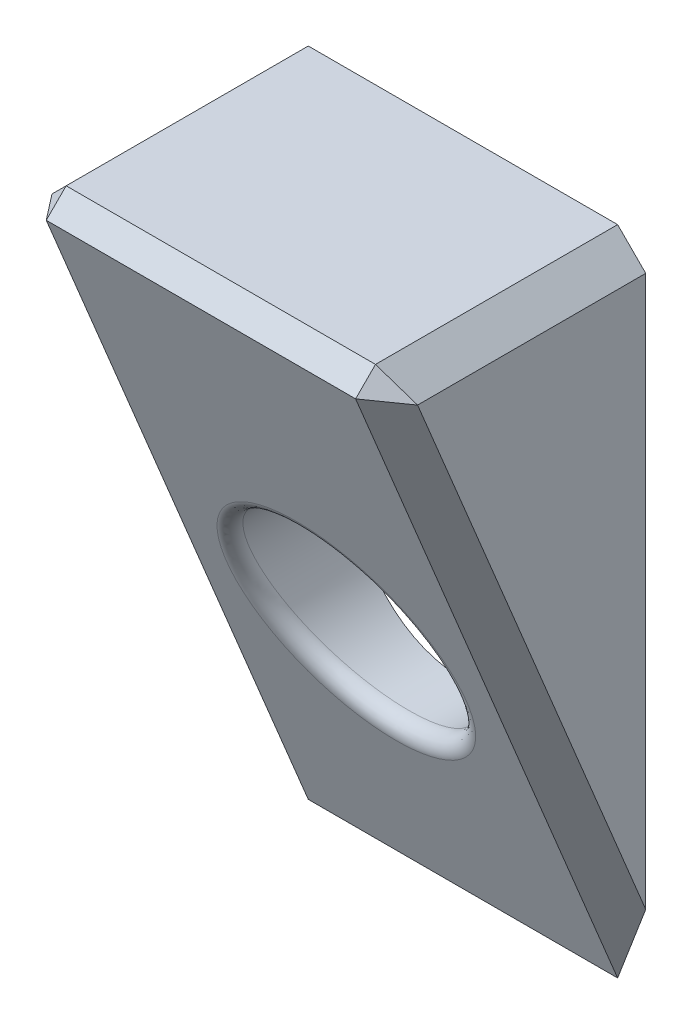
ISO-10303-21;
HEADER;
FILE_DESCRIPTION(('STEP AP214'),'2;1');
FILE_NAME('part.step','',(''),(''),'','','');
FILE_SCHEMA(('AUTOMOTIVE_DESIGN { 1 0 10303 214 1 1 1 1 }'));
ENDSEC;
DATA;
#1=APPLICATION_CONTEXT('core data for automotive mechanical design processes');
#2=APPLICATION_PROTOCOL_DEFINITION('international standard','automotive_design',2000,#1);
#3=PRODUCT_CONTEXT('',#1,'mechanical');
#4=PRODUCT('Part','Part','',(#3));
#5=PRODUCT_RELATED_PRODUCT_CATEGORY('part','',(#4));
#6=PRODUCT_DEFINITION_FORMATION('','',#4);
#7=PRODUCT_DEFINITION_CONTEXT('part definition',#1,'design');
#8=PRODUCT_DEFINITION('design','',#6,#7);
#9=PRODUCT_DEFINITION_SHAPE('','',#8);
#10=(LENGTH_UNIT() NAMED_UNIT(*) SI_UNIT(.MILLI.,.METRE.));
#11=(NAMED_UNIT(*) PLANE_ANGLE_UNIT() SI_UNIT($,.RADIAN.));
#12=(NAMED_UNIT(*) SI_UNIT($,.STERADIAN.) SOLID_ANGLE_UNIT());
#13=UNCERTAINTY_MEASURE_WITH_UNIT(LENGTH_MEASURE(1.E-05),#10,'distance_accuracy_value','');
#14=(GEOMETRIC_REPRESENTATION_CONTEXT(3) GLOBAL_UNCERTAINTY_ASSIGNED_CONTEXT((#13)) GLOBAL_UNIT_ASSIGNED_CONTEXT((#10,
#11,#12)) REPRESENTATION_CONTEXT('',''));
#15=CARTESIAN_POINT('',(0.,0.,0.));
#16=DIRECTION('',(0.,0.,1.));
#17=DIRECTION('',(1.,0.,0.));
#18=AXIS2_PLACEMENT_3D('',#15,#16,#17);
#19=CARTESIAN_POINT('',(13.,5.16738551201379,9.60975464705583));
#20=DIRECTION('',(0.,0.382683432365091,-0.923879532511286));
#21=DIRECTION('',(0.,0.923879532511287,0.382683432365091));
#22=AXIS2_PLACEMENT_3D('',#19,#20,#21);
#23=PLANE('',#22);
#24=CARTESIAN_POINT('',(6.5,-8.02395620416875,4.14572200231502));
#25=DIRECTION('',(0.,0.382683432365091,-0.923879532511286));
#26=DIRECTION('',(0.,-0.923879532511287,-0.382683432365091));
#27=AXIS2_PLACEMENT_3D('',#24,#25,#26);
#28=ELLIPSE('',#27,4.60016685124268,4.25);
#29=CARTESIAN_POINT('',(6.5,-12.2739562041687,2.38531436222937));
#30=VERTEX_POINT('',#29);
#31=EDGE_CURVE('E58',#30,#30,#28,.T.);
#32=ORIENTED_EDGE('',*,*,#31,.T.);
#33=EDGE_LOOP('',(#32));
#34=FACE_BOUND('',#33,.T.);
#35=DIRECTION('',(-1.,0.,0.));
#36=VECTOR('',#35,1.);
#37=CARTESIAN_POINT('',(13.,4.46027873082724,9.31686142824237));
#38=LINE('',#37,#36);
#39=CARTESIAN_POINT('',(12.,4.46027873082724,9.31686142824237));
#40=VERTEX_POINT('',#39);
#41=CARTESIAN_POINT('',(0.999999999999999,4.46027873082724,9.31686142824237));
#42=VERTEX_POINT('',#41);
#43=EDGE_CURVE('E73',#40,#42,#38,.T.);
#44=ORIENTED_EDGE('',*,*,#43,.T.);
#45=DIRECTION('',(0.,-0.923879532511287,-0.382683432365091));
#46=VECTOR('',#45,1.);
#47=CARTESIAN_POINT('',(0.999999999999999,-18.0326144879862,0.));
#48=LINE('',#47,#46);
#49=CARTESIAN_POINT('',(1.,-18.0326144879862,0.));
#50=VERTEX_POINT('',#49);
#51=EDGE_CURVE('E146',#42,#50,#48,.T.);
#52=ORIENTED_EDGE('',*,*,#51,.T.);
#53=DIRECTION('',(-1.,0.,0.));
#54=VECTOR('',#53,1.);
#55=CARTESIAN_POINT('',(13.,-18.0326144879862,0.));
#56=LINE('',#55,#54);
#57=CARTESIAN_POINT('',(12.,-18.0326144879862,0.));
#58=VERTEX_POINT('',#57);
#59=EDGE_CURVE('E122',#58,#50,#56,.T.);
#60=ORIENTED_EDGE('',*,*,#59,.F.);
#61=DIRECTION('',(0.,0.923879532511287,0.382683432365091));
#62=VECTOR('',#61,1.);
#63=CARTESIAN_POINT('',(12.,5.16738551201379,9.60975464705583));
#64=LINE('',#63,#62);
#65=EDGE_CURVE('E143',#58,#40,#64,.T.);
#66=ORIENTED_EDGE('',*,*,#65,.T.);
#67=EDGE_LOOP('',(#44,#52,#60,#66));
#68=FACE_BOUND('',#67,.T.);
#69=ADVANCED_FACE('F47',(#34,#68),#23,.F.);
#70=CARTESIAN_POINT('',(13.,5.16738551201379,0.));
#71=DIRECTION('',(0.,0.,1.));
#72=DIRECTION('',(1.,0.,0.));
#73=AXIS2_PLACEMENT_3D('',#70,#71,#72);
#74=PLANE('',#73);
#75=CARTESIAN_POINT('',(6.5,-7.8326144879862,0.));
#76=DIRECTION('',(0.,0.,-1.));
#77=DIRECTION('',(-1.,0.,0.));
#78=AXIS2_PLACEMENT_3D('',#75,#76,#77);
#79=CIRCLE('',#78,3.75);
#80=CARTESIAN_POINT('',(2.75,-7.8326144879862,0.));
#81=VERTEX_POINT('',#80);
#82=EDGE_CURVE('E167',#81,#81,#79,.T.);
#83=ORIENTED_EDGE('',*,*,#82,.F.);
#84=EDGE_LOOP('',(#83));
#85=FACE_BOUND('',#84,.T.);
#86=DIRECTION('',(0.,1.,0.));
#87=VECTOR('',#86,1.);
#88=CARTESIAN_POINT('',(0.,5.16738551201379,0.));
#89=LINE('',#88,#87);
#90=CARTESIAN_POINT('',(0.,-15.4194885582334,0.));
#91=VERTEX_POINT('',#90);
#92=CARTESIAN_POINT('',(0.,4.16738551201379,0.));
#93=VERTEX_POINT('',#92);
#94=EDGE_CURVE('E379',#91,#93,#89,.T.);
#95=ORIENTED_EDGE('',*,*,#94,.T.);
#96=DIRECTION('',(0.707106781186546,0.707106781186549,0.));
#97=VECTOR('',#96,1.);
#98=CARTESIAN_POINT('',(0.999999999999997,5.16738551201379,0.));
#99=LINE('',#98,#97);
#100=CARTESIAN_POINT('',(1.,5.16738551201379,0.));
#101=VERTEX_POINT('',#100);
#102=EDGE_CURVE('E130',#93,#101,#99,.T.);
#103=ORIENTED_EDGE('',*,*,#102,.T.);
#104=DIRECTION('',(-1.,0.,0.));
#105=VECTOR('',#104,1.);
#106=CARTESIAN_POINT('',(13.,5.16738551201379,0.));
#107=LINE('',#106,#105);
#108=CARTESIAN_POINT('',(12.,5.16738551201379,0.));
#109=VERTEX_POINT('',#108);
#110=EDGE_CURVE('E114',#109,#101,#107,.T.);
#111=ORIENTED_EDGE('',*,*,#110,.F.);
#112=DIRECTION('',(-0.707106781186547,0.707106781186547,0.));
#113=VECTOR('',#112,1.);
#114=CARTESIAN_POINT('',(13.,4.16738551201379,0.));
#115=LINE('',#114,#113);
#116=CARTESIAN_POINT('',(13.,4.16738551201379,0.));
#117=VERTEX_POINT('',#116);
#118=EDGE_CURVE('E128',#109,#117,#115,.F.);
#119=ORIENTED_EDGE('',*,*,#118,.T.);
#120=DIRECTION('',(0.,1.,0.));
#121=VECTOR('',#120,1.);
#122=CARTESIAN_POINT('',(13.,5.16738551201379,0.));
#123=LINE('',#122,#121);
#124=CARTESIAN_POINT('',(13.,-15.4194885582334,0.));
#125=VERTEX_POINT('',#124);
#126=EDGE_CURVE('E131',#125,#117,#123,.T.);
#127=ORIENTED_EDGE('',*,*,#126,.F.);
#128=DIRECTION('',(0.357406744336594,0.933948831094464,0.));
#129=VECTOR('',#128,1.);
#130=CARTESIAN_POINT('',(17.3932557613713,-3.9393580121584,0.));
#131=LINE('',#130,#129);
#132=EDGE_CURVE('E135',#125,#58,#131,.F.);
#133=ORIENTED_EDGE('',*,*,#132,.T.);
#134=ORIENTED_EDGE('',*,*,#59,.T.);
#135=DIRECTION('',(-0.357406744336593,0.933948831094465,0.));
#136=VECTOR('',#135,1.);
#137=CARTESIAN_POINT('',(-6.74415097748379,2.20382723519683,0.));
#138=LINE('',#137,#136);
#139=EDGE_CURVE('E134',#50,#91,#138,.T.);
#140=ORIENTED_EDGE('',*,*,#139,.T.);
#141=EDGE_LOOP('',(#95,#103,#111,#119,#127,#133,#134,#140));
#142=FACE_BOUND('',#141,.T.);
#143=ADVANCED_FACE('F126',(#85,#142),#74,.F.);
#144=CARTESIAN_POINT('',(13.,5.16738551201379,0.));
#145=DIRECTION('',(0.,-1.,0.));
#146=DIRECTION('',(0.,0.,-1.));
#147=AXIS2_PLACEMENT_3D('',#144,#145,#146);
#148=PLANE('',#147);
#149=ORIENTED_EDGE('',*,*,#110,.T.);
#150=DIRECTION('',(0.,0.,1.));
#151=VECTOR('',#150,1.);
#152=CARTESIAN_POINT('',(0.999999999999997,5.16738551201379,9.60975464705583));
#153=LINE('',#152,#151);
#154=CARTESIAN_POINT('',(0.999999999999997,5.16738551201379,8.60975464705583));
#155=VERTEX_POINT('',#154);
#156=EDGE_CURVE('E387',#101,#155,#153,.T.);
#157=ORIENTED_EDGE('',*,*,#156,.T.);
#158=DIRECTION('',(1.,0.,0.));
#159=VECTOR('',#158,1.);
#160=CARTESIAN_POINT('',(13.,5.16738551201379,8.60975464705583));
#161=LINE('',#160,#159);
#162=CARTESIAN_POINT('',(12.,5.16738551201379,8.60975464705583));
#163=VERTEX_POINT('',#162);
#164=EDGE_CURVE('E117',#155,#163,#161,.T.);
#165=ORIENTED_EDGE('',*,*,#164,.T.);
#166=DIRECTION('',(0.,0.,-1.));
#167=VECTOR('',#166,1.);
#168=CARTESIAN_POINT('',(12.,5.16738551201379,0.));
#169=LINE('',#168,#167);
#170=EDGE_CURVE('E110',#163,#109,#169,.T.);
#171=ORIENTED_EDGE('',*,*,#170,.T.);
#172=EDGE_LOOP('',(#149,#157,#165,#171));
#173=FACE_BOUND('',#172,.T.);
#174=ADVANCED_FACE('F112',(#173),#148,.F.);
#175=CARTESIAN_POINT('',(13.,0.,0.));
#176=DIRECTION('',(-1.,0.,0.));
#177=DIRECTION('',(0.,0.,1.));
#178=AXIS2_PLACEMENT_3D('',#175,#176,#177);
#179=PLANE('',#178);
#180=ORIENTED_EDGE('',*,*,#126,.T.);
#181=DIRECTION('',(0.,0.,1.));
#182=VECTOR('',#181,1.);
#183=CARTESIAN_POINT('',(13.,4.16738551201379,0.));
#184=LINE('',#183,#182);
#185=CARTESIAN_POINT('',(13.,4.16738551201379,8.11314888439033));
#186=VERTEX_POINT('',#185);
#187=EDGE_CURVE('E65',#117,#186,#184,.T.);
#188=ORIENTED_EDGE('',*,*,#187,.T.);
#189=DIRECTION('',(0.,-0.923879532511287,-0.382683432365091));
#190=VECTOR('',#189,1.);
#191=CARTESIAN_POINT('',(13.,-2.25813181813911,5.45161246097764));
#192=LINE('',#191,#190);
#193=EDGE_CURVE('E148',#186,#125,#192,.T.);
#194=ORIENTED_EDGE('',*,*,#193,.T.);
#195=EDGE_LOOP('',(#180,#188,#194));
#196=FACE_BOUND('',#195,.T.);
#197=ADVANCED_FACE('F238',(#196),#179,.F.);
#198=CARTESIAN_POINT('',(0.,0.,0.));
#199=DIRECTION('',(-1.,0.,0.));
#200=DIRECTION('',(0.,0.,1.));
#201=AXIS2_PLACEMENT_3D('',#198,#199,#200);
#202=PLANE('',#201);
#203=DIRECTION('',(0.,0.923879532511287,0.382683432365091));
#204=VECTOR('',#203,1.);
#205=CARTESIAN_POINT('',(0.,5.55006894437888,8.68587511454454));
#206=LINE('',#205,#204);
#207=CARTESIAN_POINT('',(0.,4.16738551201379,8.11314888439033));
#208=VERTEX_POINT('',#207);
#209=EDGE_CURVE('E389',#91,#208,#206,.T.);
#210=ORIENTED_EDGE('',*,*,#209,.T.);
#211=DIRECTION('',(0.,0.,-1.));
#212=VECTOR('',#211,1.);
#213=CARTESIAN_POINT('',(0.,4.16738551201379,0.));
#214=LINE('',#213,#212);
#215=EDGE_CURVE('E138',#208,#93,#214,.T.);
#216=ORIENTED_EDGE('',*,*,#215,.T.);
#217=ORIENTED_EDGE('',*,*,#94,.F.);
#218=EDGE_LOOP('',(#210,#216,#217));
#219=FACE_BOUND('',#218,.T.);
#220=ADVANCED_FACE('F233',(#219),#202,.T.);
#221=CARTESIAN_POINT('',(6.5,-7.8326144879862,15.));
#222=DIRECTION('',(0.,0.,-1.));
#223=DIRECTION('',(-1.,0.,0.));
#224=AXIS2_PLACEMENT_3D('',#221,#222,#223);
#225=CYLINDRICAL_SURFACE('',#224,3.75);
#226=CARTESIAN_POINT('',(6.5,-7.8326144879862,3.68378223605938));
#227=DIRECTION('',(0.,-0.424947402327079,0.905218042935219));
#228=DIRECTION('',(0.,-0.905218042935219,-0.424947402327079));
#229=AXIS2_PLACEMENT_3D('',#226,#227,#228);
#230=ELLIPSE('',#229,4.14264831469822,3.75);
#231=CARTESIAN_POINT('',(6.5,-11.5826144879862,1.92337459597372));
#232=VERTEX_POINT('',#231);
#233=EDGE_CURVE('E11',#232,#232,#230,.T.);
#234=ORIENTED_EDGE('',*,*,#233,.T.);
#235=EDGE_LOOP('',(#234));
#236=FACE_BOUND('',#235,.T.);
#237=ORIENTED_EDGE('',*,*,#82,.T.);
#238=EDGE_LOOP('',(#237));
#239=FACE_BOUND('',#238,.T.);
#240=ADVANCED_FACE('F229',(#236,#239),#225,.F.);
#241=CARTESIAN_POINT('',(13.,4.16738551201379,0.));
#242=DIRECTION('',(-0.707106781186547,-0.707106781186547,0.));
#243=DIRECTION('',(0.,0.,1.));
#244=AXIS2_PLACEMENT_3D('',#241,#242,#243);
#245=PLANE('',#244);
#246=ORIENTED_EDGE('',*,*,#118,.F.);
#247=ORIENTED_EDGE('',*,*,#170,.F.);
#248=DIRECTION('',(0.667168375633983,-0.667168375633983,-0.331319660008014));
#249=VECTOR('',#248,1.);
#250=CARTESIAN_POINT('',(12.,5.16738551201379,8.60975464705583));
#251=LINE('',#250,#249);
#252=EDGE_CURVE('E165',#186,#163,#251,.F.);
#253=ORIENTED_EDGE('',*,*,#252,.F.);
#254=ORIENTED_EDGE('',*,*,#187,.F.);
#255=EDGE_LOOP('',(#246,#247,#253,#254));
#256=FACE_BOUND('',#255,.T.);
#257=ADVANCED_FACE('F133',(#256),#245,.F.);
#258=CARTESIAN_POINT('',(13.,-2.25813181813911,5.45161246097764));
#259=DIRECTION('',(-0.707106781186547,0.270598050073099,-0.653281482438188));
#260=DIRECTION('',(0.,-0.923879532511287,-0.382683432365091));
#261=AXIS2_PLACEMENT_3D('',#258,#259,#260);
#262=PLANE('',#261);
#263=ORIENTED_EDGE('',*,*,#132,.F.);
#264=ORIENTED_EDGE('',*,*,#193,.F.);
#265=DIRECTION('',(-0.628110181084165,0.183969212707245,0.756064103892186));
#266=VECTOR('',#265,1.);
#267=CARTESIAN_POINT('',(12.2540907789744,4.38585726470262,9.01100917031379));
#268=LINE('',#267,#266);
#269=EDGE_CURVE('E162',#40,#186,#268,.F.);
#270=ORIENTED_EDGE('',*,*,#269,.F.);
#271=ORIENTED_EDGE('',*,*,#65,.F.);
#272=EDGE_LOOP('',(#263,#264,#270,#271));
#273=FACE_BOUND('',#272,.T.);
#274=ADVANCED_FACE('F219',(#273),#262,.F.);
#275=CARTESIAN_POINT('',(12.,5.16738551201379,8.60975464705583));
#276=DIRECTION('',(0.726830682541336,0.485652735458422,0.485652735458421));
#277=DIRECTION('',(-0.555570233019601,0.831469612302546,0.));
#278=AXIS2_PLACEMENT_3D('',#275,#276,#277);
#279=PLANE('',#278);
#280=ORIENTED_EDGE('',*,*,#269,.T.);
#281=ORIENTED_EDGE('',*,*,#252,.T.);
#282=DIRECTION('',(0.,0.707106781186547,-0.707106781186548));
#283=VECTOR('',#282,1.);
#284=CARTESIAN_POINT('',(12.,5.16738551201379,8.60975464705583));
#285=LINE('',#284,#283);
#286=EDGE_CURVE('E159',#40,#163,#285,.T.);
#287=ORIENTED_EDGE('',*,*,#286,.F.);
#288=EDGE_LOOP('',(#280,#281,#287));
#289=FACE_BOUND('',#288,.T.);
#290=ADVANCED_FACE('F213',(#289),#279,.T.);
#291=CARTESIAN_POINT('',(13.,4.46027873082724,9.31686142824237));
#292=DIRECTION('',(0.,-0.707106781186548,-0.707106781186547));
#293=DIRECTION('',(-1.,0.,0.));
#294=AXIS2_PLACEMENT_3D('',#291,#292,#293);
#295=PLANE('',#294);
#296=ORIENTED_EDGE('',*,*,#286,.T.);
#297=ORIENTED_EDGE('',*,*,#164,.F.);
#298=DIRECTION('',(0.,-0.707106781186547,0.707106781186548));
#299=VECTOR('',#298,1.);
#300=CARTESIAN_POINT('',(0.999999999999997,5.16738551201379,8.60975464705583));
#301=LINE('',#300,#299);
#302=EDGE_CURVE('E156',#42,#155,#301,.F.);
#303=ORIENTED_EDGE('',*,*,#302,.F.);
#304=ORIENTED_EDGE('',*,*,#43,.F.);
#305=EDGE_LOOP('',(#296,#297,#303,#304));
#306=FACE_BOUND('',#305,.T.);
#307=ADVANCED_FACE('F206',(#306),#295,.F.);
#308=CARTESIAN_POINT('',(0.999999999999997,5.16738551201379,9.60975464705583));
#309=DIRECTION('',(-0.707106781186549,-0.270598050073099,0.653281482438187));
#310=DIRECTION('',(0.,0.923879532511287,0.382683432365091));
#311=AXIS2_PLACEMENT_3D('',#308,#309,#310);
#312=PLANE('',#311);
#313=ORIENTED_EDGE('',*,*,#139,.F.);
#314=ORIENTED_EDGE('',*,*,#51,.F.);
#315=DIRECTION('',(0.628110181084164,0.183969212707243,0.756064103892187));
#316=VECTOR('',#315,1.);
#317=CARTESIAN_POINT('',(0.745909221025627,4.38585726470262,9.01100917031379));
#318=LINE('',#317,#316);
#319=EDGE_CURVE('E153',#208,#42,#318,.T.);
#320=ORIENTED_EDGE('',*,*,#319,.F.);
#321=ORIENTED_EDGE('',*,*,#209,.F.);
#322=EDGE_LOOP('',(#313,#314,#320,#321));
#323=FACE_BOUND('',#322,.T.);
#324=ADVANCED_FACE('F199',(#323),#312,.T.);
#325=CARTESIAN_POINT('',(0.999999999999997,5.16738551201379,8.60975464705583));
#326=DIRECTION('',(-0.726830682541336,0.485652735458421,0.485652735458422));
#327=DIRECTION('',(0.5555702330196,0.,0.831469612302547));
#328=AXIS2_PLACEMENT_3D('',#325,#326,#327);
#329=PLANE('',#328);
#330=ORIENTED_EDGE('',*,*,#319,.T.);
#331=ORIENTED_EDGE('',*,*,#302,.T.);
#332=DIRECTION('',(-0.667168375633982,-0.667168375633984,-0.331319660008013));
#333=VECTOR('',#332,1.);
#334=CARTESIAN_POINT('',(0.999999999999997,5.16738551201379,8.60975464705583));
#335=LINE('',#334,#333);
#336=EDGE_CURVE('E151',#208,#155,#335,.F.);
#337=ORIENTED_EDGE('',*,*,#336,.F.);
#338=EDGE_LOOP('',(#330,#331,#337));
#339=FACE_BOUND('',#338,.T.);
#340=ADVANCED_FACE('F178',(#339),#329,.T.);
#341=CARTESIAN_POINT('',(0.999999999999997,5.16738551201379,0.));
#342=DIRECTION('',(-0.707106781186549,0.707106781186546,0.));
#343=DIRECTION('',(0.,0.,-1.));
#344=AXIS2_PLACEMENT_3D('',#341,#342,#343);
#345=PLANE('',#344);
#346=ORIENTED_EDGE('',*,*,#102,.F.);
#347=ORIENTED_EDGE('',*,*,#215,.F.);
#348=ORIENTED_EDGE('',*,*,#336,.T.);
#349=ORIENTED_EDGE('',*,*,#156,.F.);
#350=EDGE_LOOP('',(#346,#347,#348,#349));
#351=FACE_BOUND('',#350,.T.);
#352=ADVANCED_FACE('F173',(#351),#345,.T.);
#353=CARTESIAN_POINT('',(6.5,-11.5826144879862,1.92337459597372));
#354=CARTESIAN_POINT('',(6.5,-11.5826144879862,2.67167747730647));
#355=CARTESIAN_POINT('',(6.5,-12.2739562041687,2.38531436222937));
#356=CARTESIAN_POINT('',(6.33629628844766,-11.5826144879862,1.92337459597372));
#357=CARTESIAN_POINT('',(6.34982423694392,-11.5826144879862,2.67167747730647));
#358=CARTESIAN_POINT('',(6.31446912690735,-12.2739562041687,2.38531436222937));
#359=CARTESIAN_POINT('',(6.17259257689533,-11.5718688481909,1.92841905101192));
#360=CARTESIAN_POINT('',(6.19991535972019,-11.5736941762921,2.67537239139076));
#361=CARTESIAN_POINT('',(6.1289382538147,-12.2617778124008,2.39035881726756));
#362=CARTESIAN_POINT('',(5.84799232155408,-11.529134888524,1.94848016810225));
#363=CARTESIAN_POINT('',(5.90103134274787,-11.5378882832473,2.69020367790279));
#364=CARTESIAN_POINT('',(5.76105796442796,-12.2133459914449,2.41041993435789));
#365=CARTESIAN_POINT('',(5.68710526446067,-11.4970852291886,1.96352562547725));
#366=CARTESIAN_POINT('',(5.75257293556618,-11.5110759027331,2.7013097295513));
#367=CARTESIAN_POINT('',(5.57871929972209,-12.1770230441981,2.4254653917329));
#368=CARTESIAN_POINT('',(5.37087726767107,-11.4123530901388,2.00330245346229));
#369=CARTESIAN_POINT('',(5.45825218531089,-11.4393117526863,2.73103541379283));
#370=CARTESIAN_POINT('',(5.22032757002721,-12.0809932866084,2.46524221971794));
#371=CARTESIAN_POINT('',(5.21557204251773,-11.3595571466939,2.02808708871725));
#372=CARTESIAN_POINT('',(5.31285745389423,-11.3944988564846,2.74959752316882));
#373=CARTESIAN_POINT('',(5.0443149815201,-12.0211578840374,2.49002685497289));
#374=CARTESIAN_POINT('',(4.91313482505802,-11.2342847792195,2.08689520412886));
#375=CARTESIAN_POINT('',(5.02662355338587,-11.2866369747938,2.79427537742823));
#376=CARTESIAN_POINT('',(4.70155280173242,-11.8791825342331,2.54883497038451));
#377=CARTESIAN_POINT('',(4.76607550115616,-11.1616590063907,2.12098879489018));
#378=CARTESIAN_POINT('',(4.88617631625704,-11.2237788087994,2.82031208228901));
#379=CARTESIAN_POINT('',(4.53488556797698,-11.7968733250272,2.58292856114582));
#380=CARTESIAN_POINT('',(4.48260703579815,-10.9979998670855,2.19781727467756));
#381=CARTESIAN_POINT('',(4.61210788077741,-11.0799646139666,2.8798818722505));
#382=CARTESIAN_POINT('',(4.2136213072379,-11.6113929671479,2.6597570409332));
#383=CARTESIAN_POINT('',(4.34631017855817,-10.906800931251,2.24062988892043));
#384=CARTESIAN_POINT('',(4.47878418756517,-10.9992336878075,2.91332171676857));
#385=CARTESIAN_POINT('',(4.05915153569926,-11.5080341732022,2.70256965517608));
#386=CARTESIAN_POINT('',(4.08665907806949,-10.7075652135072,2.33415951017219));
#387=CARTESIAN_POINT('',(4.22147240173298,-10.8201884860456,2.98748466761618));
#388=CARTESIAN_POINT('',(3.76488028847875,-11.2822336930926,2.79609927642783));
#389=CARTESIAN_POINT('',(3.96345133872488,-10.5993658797249,2.38495282586355));
#390=CARTESIAN_POINT('',(4.09767714922282,-10.7221145399291,3.02810822621305));
#391=CARTESIAN_POINT('',(3.62524485055487,-11.1596077814726,2.84689259211919));
#392=CARTESIAN_POINT('',(3.73205460948424,-10.367970770609,2.49357941732115));
#393=CARTESIAN_POINT('',(3.86204085160101,-10.5093669358623,3.11623116917992));
#394=CARTESIAN_POINT('',(3.36299522408214,-10.8973599911413,2.95551918357679));
#395=CARTESIAN_POINT('',(3.62403455042671,-10.2446311632946,2.55148021386555));
#396=CARTESIAN_POINT('',(3.75028551033849,-10.3949305568852,3.16363226938108));
#397=CARTESIAN_POINT('',(3.24057249048361,-10.7575751028516,3.01341998012119));
#398=CARTESIAN_POINT('',(3.42484298573715,-9.98504126653803,2.67334262387602));
#399=CARTESIAN_POINT('',(3.54130419811893,-10.1509441029614,3.26469476763164));
#400=CARTESIAN_POINT('',(3.01482205050211,-10.4633732198608,3.13528239013166));
#401=CARTESIAN_POINT('',(3.33384718792078,-9.84867617749844,2.73735812909902));
#402=CARTESIAN_POINT('',(3.44406044427285,-10.0216121357664,3.31826582249224));
#403=CARTESIAN_POINT('',(2.91169347964355,-10.3088261189493,3.19929789535467));
#404=CARTESIAN_POINT('',(3.17025929776495,-9.56533519781784,2.87037029586678));
#405=CARTESIAN_POINT('',(3.26648895751602,-9.74980289778662,3.43085289524174));
#406=CARTESIAN_POINT('',(2.72629387080027,-9.98770634197794,3.33231006212242));
#407=CARTESIAN_POINT('',(3.09783284022871,-9.41827787806089,2.93940518366162));
#408=CARTESIAN_POINT('',(3.18604783679383,-9.60751109363765,3.48979209033478));
#409=CARTESIAN_POINT('',(2.64421055225921,-9.82104137958672,3.40134494991726));
#410=CARTESIAN_POINT('',(2.9726381469138,-9.11603265254446,3.08129179810923));
#411=CARTESIAN_POINT('',(3.04415993974084,-9.31217475968189,3.6121244053208));
#412=CARTESIAN_POINT('',(2.50232323316897,-9.4784967906681,3.54323156436487));
#413=CARTESIAN_POINT('',(2.92000969312223,-8.96079544293948,3.15416667005968));
#414=CARTESIAN_POINT('',(2.98251469778597,-9.15927204632186,3.67545878291817));
#415=CARTESIAN_POINT('',(2.44267765220519,-9.30256128644912,3.61610643631532));
#416=CARTESIAN_POINT('',(2.83534218857542,-8.64481346474449,3.30250189367137));
#417=CARTESIAN_POINT('',(2.87990036953432,-8.84545039985057,3.80544796505284));
#418=CARTESIAN_POINT('',(2.34672114705214,-8.94444837782813,3.76444165992701));
#419=CARTESIAN_POINT('',(2.80340403361202,-8.48404567415238,3.37797305282818));
#420=CARTESIAN_POINT('',(2.83865992203734,-8.68462055730425,3.87206586706985));
#421=CARTESIAN_POINT('',(2.31052457142696,-8.76224488182374,3.83991281908383));
#422=CARTESIAN_POINT('',(2.76070653183443,-8.15972736585067,3.53022170022924));
#423=CARTESIAN_POINT('',(2.77808264966778,-8.35793563509705,4.00738319247087));
#424=CARTESIAN_POINT('',(2.26213406941235,-8.39468413241515,3.99216146648489));
#425=CARTESIAN_POINT('',(2.75,-7.99617092691844,3.60700196814431));
#426=CARTESIAN_POINT('',(2.75841505583526,-8.19210926615728,4.07607072348481));
#427=CARTESIAN_POINT('',(2.25,-8.20932016829195,4.06894173439996));
#428=CARTESIAN_POINT('',(2.75,-7.66905804905397,3.76056250397445));
#429=CARTESIAN_POINT('',(2.74172423556027,-7.85858651939421,4.214220368554));
#430=CARTESIAN_POINT('',(2.25,-7.83859224004555,4.22250227023009));
#431=CARTESIAN_POINT('',(2.76070653183443,-7.50550161012174,3.83734277188952));
#432=CARTESIAN_POINT('',(2.74432577896288,-7.6908520164366,4.28369827455695));
#433=CARTESIAN_POINT('',(2.26213406941235,-7.65322827592235,4.29928253814516));
#434=CARTESIAN_POINT('',(2.80340403361202,-7.18118330182003,3.98959141929058));
#435=CARTESIAN_POINT('',(2.77241467364508,-7.35674600104344,4.42208951740324));
#436=CARTESIAN_POINT('',(2.31052457142696,-7.28566752651375,4.45153118554622));
#437=CARTESIAN_POINT('',(2.83534218857542,-7.02041551122792,4.06506257844739));
#438=CARTESIAN_POINT('',(2.79749915696288,-7.1902644945774,4.49104841526577));
#439=CARTESIAN_POINT('',(2.34672114705214,-7.10346403050936,4.52700234470303));
#440=CARTESIAN_POINT('',(2.92000969312223,-6.70443353303293,4.21339780205908));
#441=CARTESIAN_POINT('',(2.87029838450868,-6.86189438534544,4.62706376798759));
#442=CARTESIAN_POINT('',(2.44267765220519,-6.74535112188838,4.67533756831472));
#443=CARTESIAN_POINT('',(2.9726381469138,-6.54919632342795,4.28627267400953));
#444=CARTESIAN_POINT('',(2.91760172745826,-6.69982103646975,4.69419674719112));
#445=CARTESIAN_POINT('',(2.50232323316897,-6.5694156176694,4.74821244026518));
#446=CARTESIAN_POINT('',(3.09783284022871,-6.24695109791152,4.42815928845714));
#447=CARTESIAN_POINT('',(3.03409976817235,-6.38341916460039,4.82525469367965));
#448=CARTESIAN_POINT('',(2.64421055225921,-6.22687102875077,4.89009905471278));
#449=CARTESIAN_POINT('',(3.17025929776495,-6.09989377815456,4.49719417625199));
#450=CARTESIAN_POINT('',(3.10289601935418,-6.22883159265667,4.88928696255306));
#451=CARTESIAN_POINT('',(2.72629387080027,-6.06020606635956,4.95913394250763));
#452=CARTESIAN_POINT('',(3.33384718792077,-5.81655279847397,4.63020634301974));
#453=CARTESIAN_POINT('',(3.26118028364824,-5.93040592921319,5.01289891971154));
#454=CARTESIAN_POINT('',(2.91169347964354,-5.73908628938822,5.09214610927538));
#455=CARTESIAN_POINT('',(3.42484298573715,-5.68018770943438,4.69422184824274));
#456=CARTESIAN_POINT('',(3.35030619830716,-5.7862397567039,5.07261450360031));
#457=CARTESIAN_POINT('',(3.01482205050211,-5.58453918847668,5.15616161449838));
#458=CARTESIAN_POINT('',(3.62403455042671,-5.42059781267783,4.81608425825321));
#459=CARTESIAN_POINT('',(3.54762005960839,-5.51145022529591,5.18643605430765));
#460=CARTESIAN_POINT('',(3.24057249048361,-5.29033730548593,5.27802402450886));
#461=CARTESIAN_POINT('',(3.73205460948424,-5.29725820536339,4.87398505479762));
#462=CARTESIAN_POINT('',(3.6555062560358,-5.38044137080596,5.24070169862835));
#463=CARTESIAN_POINT('',(3.36299522408214,-5.15055241719623,5.33592482105326));
#464=CARTESIAN_POINT('',(3.96345133872488,-5.06586309624754,4.98261164625522));
#465=CARTESIAN_POINT('',(3.88831887868143,-5.13448955001027,5.34257827849228));
#466=CARTESIAN_POINT('',(3.62524485055487,-4.88830462686493,5.44455141251086));
#467=CARTESIAN_POINT('',(4.08665907806949,-4.9576637624652,5.03340496194658));
#468=CARTESIAN_POINT('',(4.01302625077699,-5.01912278871377,5.39036475566835));
#469=CARTESIAN_POINT('',(3.76488028847875,-4.76567871524495,5.49534472820222));
#470=CARTESIAN_POINT('',(4.34631017855817,-4.75842804472143,5.12693458319833));
#471=CARTESIAN_POINT('',(4.27711303099589,-4.80665459838543,5.47837196167522));
#472=CARTESIAN_POINT('',(4.05915153569926,-4.53987823513534,5.58887434945397));
#473=CARTESIAN_POINT('',(4.48260703579815,-4.66722910888692,5.1697471974412));
#474=CARTESIAN_POINT('',(4.41637362342018,-4.7091179306675,5.51877297227266));
#475=CARTESIAN_POINT('',(4.2136213072379,-4.43651944118956,5.63168696369684));
#476=CARTESIAN_POINT('',(4.76607550115616,-4.50356996958173,5.24657567722859));
#477=CARTESIAN_POINT('',(4.70690570453762,-4.53413908478522,5.59125158336549));
#478=CARTESIAN_POINT('',(4.53488556797698,-4.25103908331034,5.70851544348423));
#479=CARTESIAN_POINT('',(4.91313482505802,-4.43094419675294,5.2806692679899));
#480=CARTESIAN_POINT('',(4.85816770204689,-4.45628359354824,5.62350038374107));
#481=CARTESIAN_POINT('',(4.70155280173242,-4.16872987410438,5.74260903424554));
#482=CARTESIAN_POINT('',(5.21557204251773,-4.30567182927855,5.33947738340151));
#483=CARTESIAN_POINT('',(5.16980940911543,-4.32208785522701,5.6790860785664));
#484=CARTESIAN_POINT('',(5.0443149815201,-4.02675452430007,5.80141714965715));
#485=CARTESIAN_POINT('',(5.37087726767107,-4.25287588583356,5.36426201865647));
#486=CARTESIAN_POINT('',(5.33028623553584,-4.26539302735193,5.70256984518866));
#487=CARTESIAN_POINT('',(5.22032757002721,-3.96691912172908,5.82620178491211));
#488=CARTESIAN_POINT('',(5.68710526446067,-4.16814374678385,5.40403884664151));
#489=CARTESIAN_POINT('',(5.65729944067345,-4.1745035785869,5.74021748754375));
#490=CARTESIAN_POINT('',(5.57871929972209,-3.87088936413941,5.86597861289715));
#491=CARTESIAN_POINT('',(5.84799232155408,-4.1360940874484,5.41908430401652));
#492=CARTESIAN_POINT('',(5.82402309729074,-4.14004852024738,5.75448924000034));
#493=CARTESIAN_POINT('',(5.76105796442796,-3.83456641689257,5.88102407027216));
#494=CARTESIAN_POINT('',(6.17259257689532,-4.09336012778149,5.43914542110685));
#495=CARTESIAN_POINT('',(6.16037748011252,-4.09417301231654,5.77349149756605));
#496=CARTESIAN_POINT('',(6.1289382538147,-3.78613459593673,5.90108518736249));
#497=CARTESIAN_POINT('',(6.33629628844766,-4.0826144879862,5.44418987614504));
#498=CARTESIAN_POINT('',(6.33025603719249,-4.0826144879862,5.77827919510469));
#499=CARTESIAN_POINT('',(6.31446912690735,-3.77395620416875,5.90612964240068));
#500=CARTESIAN_POINT('',(6.66370371155234,-4.0826144879862,5.44418987614504));
#501=CARTESIAN_POINT('',(6.66974396280751,-4.0826144879862,5.77827919510469));
#502=CARTESIAN_POINT('',(6.68553087309265,-3.77395620416875,5.90612964240068));
#503=CARTESIAN_POINT('',(6.82740742310467,-4.09336012778149,5.43914542110685));
#504=CARTESIAN_POINT('',(6.83962251988748,-4.09417301231654,5.77349149756605));
#505=CARTESIAN_POINT('',(6.8710617461853,-3.78613459593673,5.90108518736249));
#506=CARTESIAN_POINT('',(7.15200767844592,-4.1360940874484,5.41908430401652));
#507=CARTESIAN_POINT('',(7.17597690270926,-4.14004852024738,5.75448924000034));
#508=CARTESIAN_POINT('',(7.23894203557204,-3.83456641689257,5.88102407027216));
#509=CARTESIAN_POINT('',(7.31289473553933,-4.16814374678385,5.40403884664151));
#510=CARTESIAN_POINT('',(7.34270055932655,-4.17450357858689,5.74021748754375));
#511=CARTESIAN_POINT('',(7.4212807002779,-3.87088936413941,5.86597861289715));
#512=CARTESIAN_POINT('',(7.62912273232893,-4.25287588583356,5.36426201865647));
#513=CARTESIAN_POINT('',(7.66971376446415,-4.26539302735193,5.70256984518866));
#514=CARTESIAN_POINT('',(7.77967242997279,-3.96691912172908,5.82620178491211));
#515=CARTESIAN_POINT('',(7.78442795748227,-4.30567182927855,5.33947738340151));
#516=CARTESIAN_POINT('',(7.83019059088457,-4.32208785522701,5.6790860785664));
#517=CARTESIAN_POINT('',(7.9556850184799,-4.02675452430007,5.80141714965715));
#518=CARTESIAN_POINT('',(8.08686517494198,-4.43094419675294,5.2806692679899));
#519=CARTESIAN_POINT('',(8.14183229795311,-4.45628359354824,5.62350038374107));
#520=CARTESIAN_POINT('',(8.29844719826757,-4.16872987410438,5.74260903424554));
#521=CARTESIAN_POINT('',(8.23392449884384,-4.50356996958173,5.24657567722859));
#522=CARTESIAN_POINT('',(8.29309429546238,-4.53413908478522,5.59125158336549));
#523=CARTESIAN_POINT('',(8.46511443202302,-4.25103908331034,5.70851544348423));
#524=CARTESIAN_POINT('',(8.51739296420185,-4.66722910888692,5.1697471974412));
#525=CARTESIAN_POINT('',(8.58362637657982,-4.7091179306675,5.51877297227266));
#526=CARTESIAN_POINT('',(8.7863786927621,-4.43651944118956,5.63168696369684));
#527=CARTESIAN_POINT('',(8.65368982144183,-4.75842804472143,5.12693458319833));
#528=CARTESIAN_POINT('',(8.72288696900411,-4.80665459838543,5.47837196167522));
#529=CARTESIAN_POINT('',(8.94084846430074,-4.53987823513534,5.58887434945397));
#530=CARTESIAN_POINT('',(8.91334092193051,-4.9576637624652,5.03340496194658));
#531=CARTESIAN_POINT('',(8.98697374922301,-5.01912278871377,5.39036475566835));
#532=CARTESIAN_POINT('',(9.23511971152125,-4.76567871524494,5.49534472820222));
#533=CARTESIAN_POINT('',(9.03654866127512,-5.06586309624754,4.98261164625522));
#534=CARTESIAN_POINT('',(9.11168112131857,-5.13448955001027,5.34257827849228));
#535=CARTESIAN_POINT('',(9.37475514944513,-4.88830462686493,5.44455141251086));
#536=CARTESIAN_POINT('',(9.26794539051576,-5.29725820536339,4.87398505479762));
#537=CARTESIAN_POINT('',(9.3444937439642,-5.38044137080596,5.24070169862835));
#538=CARTESIAN_POINT('',(9.63700477591786,-5.15055241719623,5.33592482105326));
#539=CARTESIAN_POINT('',(9.37596544957329,-5.42059781267783,4.81608425825321));
#540=CARTESIAN_POINT('',(9.45237994039161,-5.51145022529591,5.18643605430765));
#541=CARTESIAN_POINT('',(9.75942750951639,-5.29033730548593,5.27802402450886));
#542=CARTESIAN_POINT('',(9.57515701426284,-5.68018770943438,4.69422184824274));
#543=CARTESIAN_POINT('',(9.64969380169284,-5.7862397567039,5.07261450360031));
#544=CARTESIAN_POINT('',(9.98517794949789,-5.58453918847668,5.15616161449839));
#545=CARTESIAN_POINT('',(9.66615281207922,-5.81655279847397,4.63020634301974));
#546=CARTESIAN_POINT('',(9.73881971635176,-5.93040592921319,5.01289891971154));
#547=CARTESIAN_POINT('',(10.0883065203565,-5.73908628938822,5.09214610927538));
#548=CARTESIAN_POINT('',(9.82974070223505,-6.09989377815456,4.49719417625199));
#549=CARTESIAN_POINT('',(9.89710398064582,-6.22883159265667,4.88928696255307));
#550=CARTESIAN_POINT('',(10.2737061291997,-6.06020606635956,4.95913394250763));
#551=CARTESIAN_POINT('',(9.90216715977128,-6.24695109791152,4.42815928845714));
#552=CARTESIAN_POINT('',(9.96590023182765,-6.38341916460039,4.82525469367965));
#553=CARTESIAN_POINT('',(10.3557894477408,-6.22687102875077,4.89009905471278));
#554=CARTESIAN_POINT('',(10.0273618530862,-6.54919632342795,4.28627267400953));
#555=CARTESIAN_POINT('',(10.0823982725417,-6.69982103646975,4.69419674719112));
#556=CARTESIAN_POINT('',(10.497676766831,-6.5694156176694,4.74821244026518));
#557=CARTESIAN_POINT('',(10.0799903068778,-6.70443353303293,4.21339780205908));
#558=CARTESIAN_POINT('',(10.1297016154913,-6.86189438534544,4.62706376798759));
#559=CARTESIAN_POINT('',(10.5573223477948,-6.74535112188838,4.67533756831472));
#560=CARTESIAN_POINT('',(10.1646578114246,-7.02041551122792,4.06506257844739));
#561=CARTESIAN_POINT('',(10.2025008430371,-7.1902644945774,4.49104841526577));
#562=CARTESIAN_POINT('',(10.6532788529479,-7.10346403050936,4.52700234470303));
#563=CARTESIAN_POINT('',(10.196595966388,-7.18118330182003,3.98959141929058));
#564=CARTESIAN_POINT('',(10.2275853263549,-7.35674600104344,4.42208951740324));
#565=CARTESIAN_POINT('',(10.689475428573,-7.28566752651375,4.45153118554622));
#566=CARTESIAN_POINT('',(10.2392934681656,-7.50550161012173,3.83734277188952));
#567=CARTESIAN_POINT('',(10.2556742210371,-7.6908520164366,4.28369827455695));
#568=CARTESIAN_POINT('',(10.7378659305876,-7.65322827592235,4.29928253814516));
#569=CARTESIAN_POINT('',(10.25,-7.66905804905397,3.76056250397445));
#570=CARTESIAN_POINT('',(10.2582757644397,-7.85858651939421,4.214220368554));
#571=CARTESIAN_POINT('',(10.75,-7.83859224004555,4.22250227023009));
#572=CARTESIAN_POINT('',(10.25,-7.99617092691844,3.60700196814431));
#573=CARTESIAN_POINT('',(10.2415849441647,-8.19210926615728,4.07607072348481));
#574=CARTESIAN_POINT('',(10.75,-8.20932016829195,4.06894173439996));
#575=CARTESIAN_POINT('',(10.2392934681656,-8.15972736585067,3.53022170022924));
#576=CARTESIAN_POINT('',(10.2219173503322,-8.35793563509705,4.00738319247087));
#577=CARTESIAN_POINT('',(10.7378659305876,-8.39468413241515,3.99216146648489));
#578=CARTESIAN_POINT('',(10.196595966388,-8.48404567415237,3.37797305282818));
#579=CARTESIAN_POINT('',(10.1613400779627,-8.68462055730424,3.87206586706985));
#580=CARTESIAN_POINT('',(10.689475428573,-8.76224488182374,3.83991281908383));
#581=CARTESIAN_POINT('',(10.1646578114246,-8.64481346474448,3.30250189367137));
#582=CARTESIAN_POINT('',(10.1200996304657,-8.84545039985056,3.80544796505284));
#583=CARTESIAN_POINT('',(10.6532788529479,-8.94444837782813,3.76444165992702));
#584=CARTESIAN_POINT('',(10.0799903068778,-8.96079544293947,3.15416667005968));
#585=CARTESIAN_POINT('',(10.017485302214,-9.15927204632185,3.67545878291818));
#586=CARTESIAN_POINT('',(10.5573223477948,-9.30256128644912,3.61610643631533));
#587=CARTESIAN_POINT('',(10.0273618530862,-9.11603265254445,3.08129179810923));
#588=CARTESIAN_POINT('',(9.95584006025916,-9.31217475968189,3.6121244053208));
#589=CARTESIAN_POINT('',(10.497676766831,-9.4784967906681,3.54323156436488));
#590=CARTESIAN_POINT('',(9.90216715977128,-9.41827787806089,2.93940518366162));
#591=CARTESIAN_POINT('',(9.81395216320617,-9.60751109363764,3.48979209033478));
#592=CARTESIAN_POINT('',(10.3557894477408,-9.82104137958672,3.40134494991727));
#593=CARTESIAN_POINT('',(9.82974070223505,-9.56533519781784,2.87037029586678));
#594=CARTESIAN_POINT('',(9.73351104248398,-9.74980289778662,3.43085289524174));
#595=CARTESIAN_POINT('',(10.2737061291997,-9.98770634197794,3.33231006212242));
#596=CARTESIAN_POINT('',(9.66615281207922,-9.84867617749844,2.73735812909903));
#597=CARTESIAN_POINT('',(9.55593955572716,-10.0216121357664,3.31826582249224));
#598=CARTESIAN_POINT('',(10.0883065203565,-10.3088261189493,3.19929789535467));
#599=CARTESIAN_POINT('',(9.57515701426285,-9.98504126653803,2.67334262387602));
#600=CARTESIAN_POINT('',(9.45869580188108,-10.1509441029614,3.26469476763164));
#601=CARTESIAN_POINT('',(9.98517794949789,-10.4633732198608,3.13528239013167));
#602=CARTESIAN_POINT('',(9.37596544957329,-10.2446311632946,2.55148021386555));
#603=CARTESIAN_POINT('',(9.24971448966151,-10.3949305568852,3.16363226938109));
#604=CARTESIAN_POINT('',(9.7594275095164,-10.7575751028516,3.01341998012119));
#605=CARTESIAN_POINT('',(9.26794539051576,-10.367970770609,2.49357941732115));
#606=CARTESIAN_POINT('',(9.13795914839899,-10.5093669358623,3.11623116917992));
#607=CARTESIAN_POINT('',(9.63700477591787,-10.8973599911413,2.95551918357679));
#608=CARTESIAN_POINT('',(9.03654866127512,-10.5993658797249,2.38495282586355));
#609=CARTESIAN_POINT('',(8.90232285077718,-10.7221145399291,3.02810822621305));
#610=CARTESIAN_POINT('',(9.37475514944514,-11.1596077814726,2.84689259211919));
#611=CARTESIAN_POINT('',(8.91334092193051,-10.7075652135072,2.33415951017219));
#612=CARTESIAN_POINT('',(8.77852759826702,-10.8201884860456,2.98748466761618));
#613=CARTESIAN_POINT('',(9.23511971152125,-11.2822336930926,2.79609927642783));
#614=CARTESIAN_POINT('',(8.65368982144183,-10.906800931251,2.24062988892043));
#615=CARTESIAN_POINT('',(8.52121581243483,-10.9992336878075,2.91332171676857));
#616=CARTESIAN_POINT('',(8.94084846430074,-11.5080341732022,2.70256965517608));
#617=CARTESIAN_POINT('',(8.51739296420185,-10.9979998670855,2.19781727467756));
#618=CARTESIAN_POINT('',(8.38789211922258,-11.0799646139666,2.8798818722505));
#619=CARTESIAN_POINT('',(8.7863786927621,-11.6113929671479,2.65975704093321));
#620=CARTESIAN_POINT('',(8.23392449884384,-11.1616590063907,2.12098879489018));
#621=CARTESIAN_POINT('',(8.11382368374296,-11.2237788087994,2.82031208228901));
#622=CARTESIAN_POINT('',(8.46511443202302,-11.7968733250272,2.58292856114582));
#623=CARTESIAN_POINT('',(8.08686517494198,-11.2342847792195,2.08689520412886));
#624=CARTESIAN_POINT('',(7.97337644661414,-11.2866369747938,2.79427537742823));
#625=CARTESIAN_POINT('',(8.29844719826758,-11.8791825342331,2.54883497038451));
#626=CARTESIAN_POINT('',(7.78442795748227,-11.3595571466939,2.02808708871725));
#627=CARTESIAN_POINT('',(7.68714254610577,-11.3944988564846,2.74959752316882));
#628=CARTESIAN_POINT('',(7.9556850184799,-12.0211578840374,2.49002685497289));
#629=CARTESIAN_POINT('',(7.62912273232893,-11.4123530901388,2.00330245346229));
#630=CARTESIAN_POINT('',(7.54174781468911,-11.4393117526864,2.73103541379283));
#631=CARTESIAN_POINT('',(7.77967242997279,-12.0809932866084,2.46524221971794));
#632=CARTESIAN_POINT('',(7.31289473553933,-11.4970852291886,1.96352562547725));
#633=CARTESIAN_POINT('',(7.24742706443382,-11.5110759027331,2.7013097295513));
#634=CARTESIAN_POINT('',(7.42128070027791,-12.1770230441981,2.4254653917329));
#635=CARTESIAN_POINT('',(7.15200767844592,-11.529134888524,1.94848016810225));
#636=CARTESIAN_POINT('',(7.09896865725213,-11.5378882832473,2.69020367790279));
#637=CARTESIAN_POINT('',(7.23894203557204,-12.2133459914449,2.41041993435789));
#638=CARTESIAN_POINT('',(6.82740742310468,-11.5718688481909,1.92841905101192));
#639=CARTESIAN_POINT('',(6.80008464027981,-11.5736941762921,2.67537239139076));
#640=CARTESIAN_POINT('',(6.8710617461853,-12.2617778124008,2.39035881726756));
#641=CARTESIAN_POINT('',(6.66370371155234,-11.5826144879862,1.92337459597372));
#642=CARTESIAN_POINT('',(6.65017576305608,-11.5826144879862,2.67167747730647));
#643=CARTESIAN_POINT('',(6.68553087309265,-12.2739562041687,2.38531436222937));
#644=CARTESIAN_POINT('',(6.5,-11.5826144879862,1.92337459597372));
#645=CARTESIAN_POINT('',(6.5,-11.5826144879862,2.67167747730647));
#646=CARTESIAN_POINT('',(6.5,-12.2739562041687,2.38531436222937));
#647=(BOUNDED_SURFACE() B_SPLINE_SURFACE(3,2,((#353,#354,#355),(#356,#357,#358),(#359,#360,
#361),(#362,#363,#364),(#365,#366,#367),(#368,#369,#370),(#371,#372,#373),(#374,#375,#376),
(#377,#378,#379),(#380,#381,#382),(#383,#384,#385),(#386,#387,#388),(#389,#390,#391),(#392,#393,
#394),(#395,#396,#397),(#398,#399,#400),(#401,#402,#403),(#404,#405,#406),(#407,#408,#409),
(#410,#411,#412),(#413,#414,#415),(#416,#417,#418),(#419,#420,#421),(#422,#423,#424),(#425,#426,
#427),(#428,#429,#430),(#431,#432,#433),(#434,#435,#436),(#437,#438,#439),(#440,#441,#442),
(#443,#444,#445),(#446,#447,#448),(#449,#450,#451),(#452,#453,#454),(#455,#456,#457),(#458,#459,
#460),(#461,#462,#463),(#464,#465,#466),(#467,#468,#469),(#470,#471,#472),(#473,#474,#475),
(#476,#477,#478),(#479,#480,#481),(#482,#483,#484),(#485,#486,#487),(#488,#489,#490),(#491,#492,
#493),(#494,#495,#496),(#497,#498,#499),(#500,#501,#502),(#503,#504,#505),(#506,#507,#508),
(#509,#510,#511),(#512,#513,#514),(#515,#516,#517),(#518,#519,#520),(#521,#522,#523),(#524,#525,
#526),(#527,#528,#529),(#530,#531,#532),(#533,#534,#535),(#536,#537,#538),(#539,#540,#541),
(#542,#543,#544),(#545,#546,#547),(#548,#549,#550),(#551,#552,#553),(#554,#555,#556),(#557,#558,
#559),(#560,#561,#562),(#563,#564,#565),(#566,#567,#568),(#569,#570,#571),(#572,#573,#574),
(#575,#576,#577),(#578,#579,#580),(#581,#582,#583),(#584,#585,#586),(#587,#588,#589),(#590,#591,
#592),(#593,#594,#595),(#596,#597,#598),(#599,#600,#601),(#602,#603,#604),(#605,#606,#607),
(#608,#609,#610),(#611,#612,#613),(#614,#615,#616),(#617,#618,#619),(#620,#621,#622),(#623,#624,
#625),(#626,#627,#628),(#629,#630,#631),(#632,#633,#634),(#635,#636,#637),(#638,#639,#640),
(#641,#642,#643),(#644,#645,#646)),.UNSPECIFIED.,.T.,.F.,.F.) B_SPLINE_SURFACE_WITH_KNOTS((4,2,
2,2,2,2,2,2,2,2,2,2,2,2,2,2,2,2,2,2,2,2,2,2,2,2,2,2,2,2,2,2,2,2,2,2,2,2,2,2,2,2,2,2,2,2,2,2,4),
(3,3),(0.,0.556130562437576,1.11386933646303,1.67470187698171,2.23988075465769,2.81033767337868,
3.38662445871857,3.96888527301385,4.55685892778466,5.14990778837719,5.74706855091652,
6.34711986103071,6.94866197289326,7.5502040847558,8.15025539487,8.74741615740933,
9.34046501800186,9.92843867277267,10.5106994870679,11.0869862724078,11.6574431911288,
12.2226220688048,12.7834546093235,13.3411933833489,13.8973239457865,14.4534545082241,
15.0111932822496,15.5720258227682,16.1372047004442,16.7076616191652,17.2839484045051,
17.8662092188004,18.4541828735712,19.0472317341637,19.644392496703,20.2444438068172,
20.8459859186798,21.4475280305423,22.0475793406565,22.6447401031958,23.2377889637884,
23.8257626185592,24.4080234328545,24.9843102181943,25.5547671369153,26.1199460145913,
26.68077855511,27.2385173291355,27.794647891573),(0.,1.),
.UNSPECIFIED.) GEOMETRIC_REPRESENTATION_ITEM() RATIONAL_B_SPLINE_SURFACE(((1.,0.555570233019602,
1.),(1.,0.555570233019602,1.),(1.,0.556064339695409,1.),(1.,0.558021496835435,1.),(1.,
0.559487345147567,1.),(1.,0.563337794419219,1.),(1.,0.565727446579714,1.),(1.,0.571348876179858,
1.),(1.,0.574587036396807,1.),(1.,0.581808429659903,1.),(1.,0.58579833831959,1.),(1.,
0.594412238792206,1.),(1.,0.599042293998676,1.),(1.,0.60881765867005,1.),(1.,0.613967811917554,
1.),(1.,0.624661874160882,1.),(1.,0.630209150703203,1.),(1.,0.641577319154603,1.),(1.,
0.64740015952077,1.),(1.,0.659203583484966,1.),(1.,0.665184980871528,1.),(1.,0.677195864363529,
1.),(1.,0.683225443095789,1.),(1.,0.695230446649897,1.),(1.,0.701205699710938,1.),(1.,
0.713007862662157,1.),(1.,0.718834772552333,1.),(1.,0.730254376001846,1.),(1.,0.735847614230781,
1.),(1.,0.746722339565935,1.),(1.,0.752005198637822,1.),(1.,0.762189855400356,1.),(1.,
0.767094026506438,1.),(1.,0.776460047380896,1.),(1.,0.780925323292653,1.),(1.,0.789360161872453,
1.),(1.,0.793334119426912,1.),(1.,0.800740639864073,1.),(1.,0.804178339153195,1.),(1.,
0.810474253769271,1.),(1.,0.81333797949662,1.),(1.,0.818455367368328,1.),(1.,0.820714428857013,
1.),(1.,0.824599351588192,1.),(1.,0.826229948666651,1.),(1.,0.828842166269841,1.),(1.,
0.829827317177272,1.),(1.,0.831140096322329,1.),(1.,0.831469612302545,1.),(1.,0.831469612302545,
1.),(1.,0.831140096322329,1.),(1.,0.829827317177272,1.),(1.,0.828842166269841,1.),(1.,
0.826229948666651,1.),(1.,0.824599351588192,1.),(1.,0.820714428857013,1.),(1.,0.818455367368328,
1.),(1.,0.81333797949662,1.),(1.,0.810474253769271,1.),(1.,0.804178339153196,1.),(1.,
0.800740639864073,1.),(1.,0.793334119426912,1.),(1.,0.789360161872453,1.),(1.,0.780925323292653,
1.),(1.,0.776460047380896,1.),(1.,0.767094026506438,1.),(1.,0.762189855400356,1.),(1.,
0.752005198637822,1.),(1.,0.746722339565935,1.),(1.,0.735847614230781,1.),(1.,0.730254376001846,
1.),(1.,0.718834772552333,1.),(1.,0.713007862662157,1.),(1.,0.701205699710938,1.),(1.,
0.695230446649897,1.),(1.,0.683225443095789,1.),(1.,0.67719586436353,1.),(1.,0.665184980871528,
1.),(1.,0.659203583484966,1.),(1.,0.64740015952077,1.),(1.,0.641577319154603,1.),(1.,
0.630209150703203,1.),(1.,0.624661874160882,1.),(1.,0.613967811917554,1.),(1.,0.60881765867005,
1.),(1.,0.599042293998676,1.),(1.,0.594412238792206,1.),(1.,0.58579833831959,1.),(1.,
0.581808429659904,1.),(1.,0.574587036396807,1.),(1.,0.571348876179858,1.),(1.,0.565727446579714,
1.),(1.,0.563337794419219,1.),(1.,0.559487345147567,1.),(1.,0.558021496835435,1.),(1.,
0.556064339695409,1.),(1.,0.555570233019602,1.),(1.,0.555570233019602,1.))) REPRESENTATION_ITEM('') SURFACE());
#648=CARTESIAN_POINT('',(6.5,-12.0826144879862,1.92337459597372));
#649=DIRECTION('',(1.,0.,0.));
#650=DIRECTION('',(0.,1.,0.));
#651=AXIS2_PLACEMENT_3D('',#648,#649,#650);
#652=CIRCLE('',#651,0.5);
#653=EDGE_CURVE('',#232,#30,#652,.T.);
#654=ORIENTED_EDGE('',*,*,#233,.F.);
#655=ORIENTED_EDGE('',*,*,#31,.F.);
#656=ORIENTED_EDGE('',*,*,#653,.T.);
#657=ORIENTED_EDGE('',*,*,#653,.F.);
#658=EDGE_LOOP('',(#654,#656,#655,#657));
#659=FACE_BOUND('',#658,.T.);
#660=ADVANCED_FACE('F49',(#659),#647,.T.);
#661=CLOSED_SHELL('',(#69,#143,#174,#197,#220,#240,#257,#274,#290,#307,#324,#340,#352,#660));
#662=MANIFOLD_SOLID_BREP('B2',#661);
#663=ADVANCED_BREP_SHAPE_REPRESENTATION('',(#18,#662),#14);
#664=SHAPE_DEFINITION_REPRESENTATION(#9,#663);
ENDSEC;
END-ISO-10303-21;
